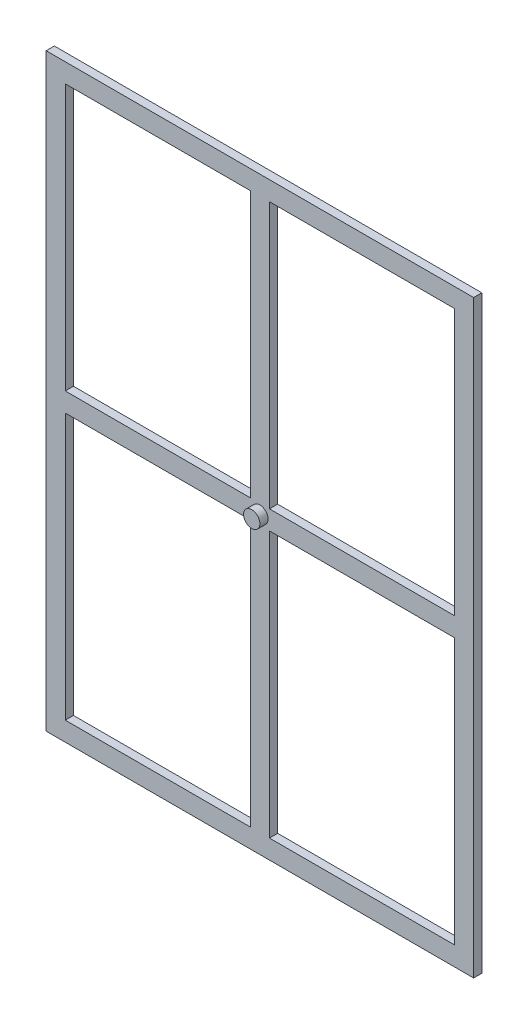
ISO-10303-21;
HEADER;
FILE_DESCRIPTION(('STEP AP214'),'2;1');
FILE_NAME('part.step','',(''),(''),'','','');
FILE_SCHEMA(('AUTOMOTIVE_DESIGN { 1 0 10303 214 1 1 1 1 }'));
ENDSEC;
DATA;
#1=APPLICATION_CONTEXT('core data for automotive mechanical design processes');
#2=APPLICATION_PROTOCOL_DEFINITION('international standard','automotive_design',2000,#1);
#3=PRODUCT_CONTEXT('',#1,'mechanical');
#4=PRODUCT('Part','Part','',(#3));
#5=PRODUCT_RELATED_PRODUCT_CATEGORY('part','',(#4));
#6=PRODUCT_DEFINITION_FORMATION('','',#4);
#7=PRODUCT_DEFINITION_CONTEXT('part definition',#1,'design');
#8=PRODUCT_DEFINITION('design','',#6,#7);
#9=PRODUCT_DEFINITION_SHAPE('','',#8);
#10=(LENGTH_UNIT() NAMED_UNIT(*) SI_UNIT(.MILLI.,.METRE.));
#11=(NAMED_UNIT(*) PLANE_ANGLE_UNIT() SI_UNIT($,.RADIAN.));
#12=(NAMED_UNIT(*) SI_UNIT($,.STERADIAN.) SOLID_ANGLE_UNIT());
#13=UNCERTAINTY_MEASURE_WITH_UNIT(LENGTH_MEASURE(1.E-05),#10,'distance_accuracy_value','');
#14=(GEOMETRIC_REPRESENTATION_CONTEXT(3) GLOBAL_UNCERTAINTY_ASSIGNED_CONTEXT((#13)) GLOBAL_UNIT_ASSIGNED_CONTEXT((#10,
#11,#12)) REPRESENTATION_CONTEXT('',''));
#15=CARTESIAN_POINT('',(0.,0.,0.));
#16=DIRECTION('',(0.,0.,1.));
#17=DIRECTION('',(1.,0.,0.));
#18=AXIS2_PLACEMENT_3D('',#15,#16,#17);
#19=CARTESIAN_POINT('',(0.,0.,3.));
#20=DIRECTION('',(0.,0.,1.));
#21=DIRECTION('',(1.,0.,0.));
#22=AXIS2_PLACEMENT_3D('',#19,#20,#21);
#23=PLANE('',#22);
#24=CARTESIAN_POINT('',(0.,0.,3.));
#25=DIRECTION('',(0.,0.,1.));
#26=DIRECTION('',(1.,0.,0.));
#27=AXIS2_PLACEMENT_3D('',#24,#25,#26);
#28=CIRCLE('',#27,3.);
#29=CARTESIAN_POINT('',(3.,0.,3.));
#30=VERTEX_POINT('',#29);
#31=EDGE_CURVE('E716',#30,#30,#28,.T.);
#32=ORIENTED_EDGE('',*,*,#31,.F.);
#33=EDGE_LOOP('',(#32));
#34=FACE_BOUND('',#33,.T.);
#35=DIRECTION('',(0.,-1.,0.));
#36=VECTOR('',#35,1.);
#37=CARTESIAN_POINT('',(-78.34,108.,3.));
#38=LINE('',#37,#36);
#39=CARTESIAN_POINT('',(-78.34,108.,3.));
#40=VERTEX_POINT('',#39);
#41=CARTESIAN_POINT('',(-78.34,-108.,3.));
#42=VERTEX_POINT('',#41);
#43=EDGE_CURVE('E361',#40,#42,#38,.T.);
#44=ORIENTED_EDGE('',*,*,#43,.T.);
#45=DIRECTION('',(1.,0.,0.));
#46=VECTOR('',#45,1.);
#47=CARTESIAN_POINT('',(-78.34,-108.,3.));
#48=LINE('',#47,#46);
#49=CARTESIAN_POINT('',(78.34,-108.,3.));
#50=VERTEX_POINT('',#49);
#51=EDGE_CURVE('E365',#42,#50,#48,.T.);
#52=ORIENTED_EDGE('',*,*,#51,.T.);
#53=DIRECTION('',(0.,1.,0.));
#54=VECTOR('',#53,1.);
#55=CARTESIAN_POINT('',(78.34,108.,3.));
#56=LINE('',#55,#54);
#57=CARTESIAN_POINT('',(78.34,108.,3.));
#58=VERTEX_POINT('',#57);
#59=EDGE_CURVE('E369',#50,#58,#56,.T.);
#60=ORIENTED_EDGE('',*,*,#59,.T.);
#61=DIRECTION('',(-1.,0.,0.));
#62=VECTOR('',#61,1.);
#63=CARTESIAN_POINT('',(-78.34,108.,3.));
#64=LINE('',#63,#62);
#65=EDGE_CURVE('E372',#58,#40,#64,.T.);
#66=ORIENTED_EDGE('',*,*,#65,.T.);
#67=EDGE_LOOP('',(#44,#52,#60,#66));
#68=FACE_BOUND('',#67,.T.);
#69=DIRECTION('',(1.,0.,0.));
#70=VECTOR('',#69,1.);
#71=CARTESIAN_POINT('',(-71.34,3.50000000000002,3.));
#72=LINE('',#71,#70);
#73=CARTESIAN_POINT('',(-71.34,3.50000000000002,3.));
#74=VERTEX_POINT('',#73);
#75=CARTESIAN_POINT('',(-3.50000000000003,3.50000000000002,3.));
#76=VERTEX_POINT('',#75);
#77=EDGE_CURVE('E321',#74,#76,#72,.T.);
#78=ORIENTED_EDGE('',*,*,#77,.F.);
#79=DIRECTION('',(0.,-1.,0.));
#80=VECTOR('',#79,1.);
#81=CARTESIAN_POINT('',(-71.34,101.,3.));
#82=LINE('',#81,#80);
#83=CARTESIAN_POINT('',(-71.34,101.,3.));
#84=VERTEX_POINT('',#83);
#85=EDGE_CURVE('E318',#84,#74,#82,.T.);
#86=ORIENTED_EDGE('',*,*,#85,.F.);
#87=DIRECTION('',(-1.,0.,0.));
#88=VECTOR('',#87,1.);
#89=CARTESIAN_POINT('',(-71.34,101.,3.));
#90=LINE('',#89,#88);
#91=CARTESIAN_POINT('',(-3.50000000000003,101.,3.));
#92=VERTEX_POINT('',#91);
#93=EDGE_CURVE('E329',#92,#84,#90,.T.);
#94=ORIENTED_EDGE('',*,*,#93,.F.);
#95=DIRECTION('',(0.,1.,0.));
#96=VECTOR('',#95,1.);
#97=CARTESIAN_POINT('',(-3.50000000000003,101.,3.));
#98=LINE('',#97,#96);
#99=EDGE_CURVE('E325',#76,#92,#98,.T.);
#100=ORIENTED_EDGE('',*,*,#99,.F.);
#101=EDGE_LOOP('',(#78,#86,#94,#100));
#102=FACE_BOUND('',#101,.T.);
#103=DIRECTION('',(1.,0.,0.));
#104=VECTOR('',#103,1.);
#105=CARTESIAN_POINT('',(3.49999999999998,3.50000000000002,3.));
#106=LINE('',#105,#104);
#107=CARTESIAN_POINT('',(3.49999999999998,3.50000000000002,3.));
#108=VERTEX_POINT('',#107);
#109=CARTESIAN_POINT('',(71.3399999999999,3.50000000000002,3.));
#110=VERTEX_POINT('',#109);
#111=EDGE_CURVE('E278',#108,#110,#106,.T.);
#112=ORIENTED_EDGE('',*,*,#111,.F.);
#113=DIRECTION('',(0.,-1.,0.));
#114=VECTOR('',#113,1.);
#115=CARTESIAN_POINT('',(3.49999999999998,101.,3.));
#116=LINE('',#115,#114);
#117=CARTESIAN_POINT('',(3.49999999999998,101.,3.));
#118=VERTEX_POINT('',#117);
#119=EDGE_CURVE('E275',#118,#108,#116,.T.);
#120=ORIENTED_EDGE('',*,*,#119,.F.);
#121=DIRECTION('',(-1.,0.,0.));
#122=VECTOR('',#121,1.);
#123=CARTESIAN_POINT('',(3.49999999999998,101.,3.));
#124=LINE('',#123,#122);
#125=CARTESIAN_POINT('',(71.3399999999999,101.,3.));
#126=VERTEX_POINT('',#125);
#127=EDGE_CURVE('E286',#126,#118,#124,.T.);
#128=ORIENTED_EDGE('',*,*,#127,.F.);
#129=DIRECTION('',(0.,1.,0.));
#130=VECTOR('',#129,1.);
#131=CARTESIAN_POINT('',(71.3399999999999,101.,3.));
#132=LINE('',#131,#130);
#133=EDGE_CURVE('E282',#110,#126,#132,.T.);
#134=ORIENTED_EDGE('',*,*,#133,.F.);
#135=EDGE_LOOP('',(#112,#120,#128,#134));
#136=FACE_BOUND('',#135,.T.);
#137=DIRECTION('',(1.,0.,0.));
#138=VECTOR('',#137,1.);
#139=CARTESIAN_POINT('',(-71.34,-101.,3.));
#140=LINE('',#139,#138);
#141=CARTESIAN_POINT('',(-71.34,-101.,3.));
#142=VERTEX_POINT('',#141);
#143=CARTESIAN_POINT('',(-3.50000000000003,-101.,3.));
#144=VERTEX_POINT('',#143);
#145=EDGE_CURVE('E235',#142,#144,#140,.T.);
#146=ORIENTED_EDGE('',*,*,#145,.F.);
#147=DIRECTION('',(0.,-1.,0.));
#148=VECTOR('',#147,1.);
#149=CARTESIAN_POINT('',(-71.34,-3.49999999999998,3.));
#150=LINE('',#149,#148);
#151=CARTESIAN_POINT('',(-71.34,-3.49999999999998,3.));
#152=VERTEX_POINT('',#151);
#153=EDGE_CURVE('E232',#152,#142,#150,.T.);
#154=ORIENTED_EDGE('',*,*,#153,.F.);
#155=DIRECTION('',(-1.,0.,0.));
#156=VECTOR('',#155,1.);
#157=CARTESIAN_POINT('',(-71.34,-3.49999999999998,3.));
#158=LINE('',#157,#156);
#159=CARTESIAN_POINT('',(-3.50000000000003,-3.49999999999998,3.));
#160=VERTEX_POINT('',#159);
#161=EDGE_CURVE('E243',#160,#152,#158,.T.);
#162=ORIENTED_EDGE('',*,*,#161,.F.);
#163=DIRECTION('',(0.,1.,0.));
#164=VECTOR('',#163,1.);
#165=CARTESIAN_POINT('',(-3.50000000000003,-3.49999999999998,3.));
#166=LINE('',#165,#164);
#167=EDGE_CURVE('E239',#144,#160,#166,.T.);
#168=ORIENTED_EDGE('',*,*,#167,.F.);
#169=EDGE_LOOP('',(#146,#154,#162,#168));
#170=FACE_BOUND('',#169,.T.);
#171=DIRECTION('',(1.,0.,0.));
#172=VECTOR('',#171,1.);
#173=CARTESIAN_POINT('',(3.49999999999998,-101.,3.));
#174=LINE('',#173,#172);
#175=CARTESIAN_POINT('',(3.49999999999998,-101.,3.));
#176=VERTEX_POINT('',#175);
#177=CARTESIAN_POINT('',(71.3399999999999,-101.,3.));
#178=VERTEX_POINT('',#177);
#179=EDGE_CURVE('E191',#176,#178,#174,.T.);
#180=ORIENTED_EDGE('',*,*,#179,.F.);
#181=DIRECTION('',(0.,-1.,0.));
#182=VECTOR('',#181,1.);
#183=CARTESIAN_POINT('',(3.49999999999998,-3.49999999999998,3.));
#184=LINE('',#183,#182);
#185=CARTESIAN_POINT('',(3.49999999999998,-3.49999999999998,3.));
#186=VERTEX_POINT('',#185);
#187=EDGE_CURVE('E182',#186,#176,#184,.T.);
#188=ORIENTED_EDGE('',*,*,#187,.F.);
#189=DIRECTION('',(-1.,0.,0.));
#190=VECTOR('',#189,1.);
#191=CARTESIAN_POINT('',(3.49999999999998,-3.49999999999998,3.));
#192=LINE('',#191,#190);
#193=CARTESIAN_POINT('',(71.3399999999999,-3.49999999999998,3.));
#194=VERTEX_POINT('',#193);
#195=EDGE_CURVE('E208',#194,#186,#192,.T.);
#196=ORIENTED_EDGE('',*,*,#195,.F.);
#197=DIRECTION('',(0.,1.,0.));
#198=VECTOR('',#197,1.);
#199=CARTESIAN_POINT('',(71.3399999999999,-3.49999999999998,3.));
#200=LINE('',#199,#198);
#201=EDGE_CURVE('E204',#178,#194,#200,.T.);
#202=ORIENTED_EDGE('',*,*,#201,.F.);
#203=EDGE_LOOP('',(#180,#188,#196,#202));
#204=FACE_BOUND('',#203,.T.);
#205=ADVANCED_FACE('F44',(#34,#68,#102,#136,#170,#204),#23,.T.);
#206=CARTESIAN_POINT('',(0.,0.,0.));
#207=DIRECTION('',(0.,0.,1.));
#208=DIRECTION('',(1.,0.,0.));
#209=AXIS2_PLACEMENT_3D('',#206,#207,#208);
#210=PLANE('',#209);
#211=CARTESIAN_POINT('',(74.34,-104.,0.));
#212=DIRECTION('',(0.,0.,-1.));
#213=DIRECTION('',(-1.,0.,0.));
#214=AXIS2_PLACEMENT_3D('',#211,#212,#213);
#215=CIRCLE('',#214,2.);
#216=CARTESIAN_POINT('',(72.34,-104.,0.));
#217=VERTEX_POINT('',#216);
#218=EDGE_CURVE('E704',#217,#217,#215,.T.);
#219=ORIENTED_EDGE('',*,*,#218,.F.);
#220=EDGE_LOOP('',(#219));
#221=FACE_BOUND('',#220,.T.);
#222=CARTESIAN_POINT('',(-74.34,-104.,0.));
#223=DIRECTION('',(0.,0.,-1.));
#224=DIRECTION('',(-1.,0.,0.));
#225=AXIS2_PLACEMENT_3D('',#222,#223,#224);
#226=CIRCLE('',#225,2.);
#227=CARTESIAN_POINT('',(-76.34,-104.,0.));
#228=VERTEX_POINT('',#227);
#229=EDGE_CURVE('E734',#228,#228,#226,.T.);
#230=ORIENTED_EDGE('',*,*,#229,.F.);
#231=EDGE_LOOP('',(#230));
#232=FACE_BOUND('',#231,.T.);
#233=CARTESIAN_POINT('',(-74.34,104.,0.));
#234=DIRECTION('',(0.,0.,-1.));
#235=DIRECTION('',(-1.,0.,0.));
#236=AXIS2_PLACEMENT_3D('',#233,#234,#235);
#237=CIRCLE('',#236,2.);
#238=CARTESIAN_POINT('',(-76.34,104.,0.));
#239=VERTEX_POINT('',#238);
#240=EDGE_CURVE('E721',#239,#239,#237,.T.);
#241=ORIENTED_EDGE('',*,*,#240,.F.);
#242=EDGE_LOOP('',(#241));
#243=FACE_BOUND('',#242,.T.);
#244=CARTESIAN_POINT('',(74.34,104.,0.));
#245=DIRECTION('',(0.,0.,-1.));
#246=DIRECTION('',(-1.,0.,0.));
#247=AXIS2_PLACEMENT_3D('',#244,#245,#246);
#248=CIRCLE('',#247,2.);
#249=CARTESIAN_POINT('',(72.34,104.,0.));
#250=VERTEX_POINT('',#249);
#251=EDGE_CURVE('E717',#250,#250,#248,.T.);
#252=ORIENTED_EDGE('',*,*,#251,.F.);
#253=EDGE_LOOP('',(#252));
#254=FACE_BOUND('',#253,.T.);
#255=DIRECTION('',(0.,-1.,0.));
#256=VECTOR('',#255,1.);
#257=CARTESIAN_POINT('',(-71.34,-3.49999999999998,0.));
#258=LINE('',#257,#256);
#259=CARTESIAN_POINT('',(-71.34,-3.49999999999998,0.));
#260=VERTEX_POINT('',#259);
#261=CARTESIAN_POINT('',(-71.34,-101.,0.));
#262=VERTEX_POINT('',#261);
#263=EDGE_CURVE('E200',#260,#262,#258,.T.);
#264=ORIENTED_EDGE('',*,*,#263,.T.);
#265=DIRECTION('',(1.,0.,0.));
#266=VECTOR('',#265,1.);
#267=CARTESIAN_POINT('',(-71.34,-101.,0.));
#268=LINE('',#267,#266);
#269=CARTESIAN_POINT('',(-3.50000000000003,-101.,0.));
#270=VERTEX_POINT('',#269);
#271=EDGE_CURVE('E250',#262,#270,#268,.T.);
#272=ORIENTED_EDGE('',*,*,#271,.T.);
#273=DIRECTION('',(0.,1.,0.));
#274=VECTOR('',#273,1.);
#275=CARTESIAN_POINT('',(-3.50000000000003,-3.49999999999998,0.));
#276=LINE('',#275,#274);
#277=CARTESIAN_POINT('',(-3.50000000000003,-3.49999999999998,0.));
#278=VERTEX_POINT('',#277);
#279=EDGE_CURVE('E254',#270,#278,#276,.T.);
#280=ORIENTED_EDGE('',*,*,#279,.T.);
#281=DIRECTION('',(-1.,0.,0.));
#282=VECTOR('',#281,1.);
#283=CARTESIAN_POINT('',(-71.34,-3.49999999999998,0.));
#284=LINE('',#283,#282);
#285=EDGE_CURVE('E236',#278,#260,#284,.T.);
#286=ORIENTED_EDGE('',*,*,#285,.T.);
#287=EDGE_LOOP('',(#264,#272,#280,#286));
#288=FACE_BOUND('',#287,.T.);
#289=DIRECTION('',(0.,-1.,0.));
#290=VECTOR('',#289,1.);
#291=CARTESIAN_POINT('',(-71.34,101.,0.));
#292=LINE('',#291,#290);
#293=CARTESIAN_POINT('',(-71.34,101.,0.));
#294=VERTEX_POINT('',#293);
#295=CARTESIAN_POINT('',(-71.34,3.50000000000002,0.));
#296=VERTEX_POINT('',#295);
#297=EDGE_CURVE('E317',#294,#296,#292,.T.);
#298=ORIENTED_EDGE('',*,*,#297,.T.);
#299=DIRECTION('',(1.,0.,0.));
#300=VECTOR('',#299,1.);
#301=CARTESIAN_POINT('',(-71.34,3.50000000000002,0.));
#302=LINE('',#301,#300);
#303=CARTESIAN_POINT('',(-3.50000000000003,3.50000000000002,0.));
#304=VERTEX_POINT('',#303);
#305=EDGE_CURVE('E336',#296,#304,#302,.T.);
#306=ORIENTED_EDGE('',*,*,#305,.T.);
#307=DIRECTION('',(0.,1.,0.));
#308=VECTOR('',#307,1.);
#309=CARTESIAN_POINT('',(-3.50000000000003,101.,0.));
#310=LINE('',#309,#308);
#311=CARTESIAN_POINT('',(-3.50000000000003,101.,0.));
#312=VERTEX_POINT('',#311);
#313=EDGE_CURVE('E340',#304,#312,#310,.T.);
#314=ORIENTED_EDGE('',*,*,#313,.T.);
#315=DIRECTION('',(-1.,0.,0.));
#316=VECTOR('',#315,1.);
#317=CARTESIAN_POINT('',(-71.34,101.,0.));
#318=LINE('',#317,#316);
#319=EDGE_CURVE('E322',#312,#294,#318,.T.);
#320=ORIENTED_EDGE('',*,*,#319,.T.);
#321=EDGE_LOOP('',(#298,#306,#314,#320));
#322=FACE_BOUND('',#321,.T.);
#323=DIRECTION('',(0.,-1.,0.));
#324=VECTOR('',#323,1.);
#325=CARTESIAN_POINT('',(-78.34,108.,0.));
#326=LINE('',#325,#324);
#327=CARTESIAN_POINT('',(-78.34,108.,0.));
#328=VERTEX_POINT('',#327);
#329=CARTESIAN_POINT('',(-78.34,-108.,0.));
#330=VERTEX_POINT('',#329);
#331=EDGE_CURVE('E360',#328,#330,#326,.T.);
#332=ORIENTED_EDGE('',*,*,#331,.F.);
#333=DIRECTION('',(-1.,0.,0.));
#334=VECTOR('',#333,1.);
#335=CARTESIAN_POINT('',(-78.34,108.,0.));
#336=LINE('',#335,#334);
#337=CARTESIAN_POINT('',(78.34,108.,0.));
#338=VERTEX_POINT('',#337);
#339=EDGE_CURVE('E366',#338,#328,#336,.T.);
#340=ORIENTED_EDGE('',*,*,#339,.F.);
#341=DIRECTION('',(0.,1.,0.));
#342=VECTOR('',#341,1.);
#343=CARTESIAN_POINT('',(78.34,108.,0.));
#344=LINE('',#343,#342);
#345=CARTESIAN_POINT('',(78.34,-108.,0.));
#346=VERTEX_POINT('',#345);
#347=EDGE_CURVE('E382',#346,#338,#344,.T.);
#348=ORIENTED_EDGE('',*,*,#347,.F.);
#349=DIRECTION('',(1.,0.,0.));
#350=VECTOR('',#349,1.);
#351=CARTESIAN_POINT('',(-78.34,-108.,0.));
#352=LINE('',#351,#350);
#353=EDGE_CURVE('E379',#330,#346,#352,.T.);
#354=ORIENTED_EDGE('',*,*,#353,.F.);
#355=EDGE_LOOP('',(#332,#340,#348,#354));
#356=FACE_BOUND('',#355,.T.);
#357=DIRECTION('',(0.,-1.,0.));
#358=VECTOR('',#357,1.);
#359=CARTESIAN_POINT('',(3.49999999999998,101.,0.));
#360=LINE('',#359,#358);
#361=CARTESIAN_POINT('',(3.49999999999998,101.,0.));
#362=VERTEX_POINT('',#361);
#363=CARTESIAN_POINT('',(3.49999999999998,3.50000000000002,0.));
#364=VERTEX_POINT('',#363);
#365=EDGE_CURVE('E274',#362,#364,#360,.T.);
#366=ORIENTED_EDGE('',*,*,#365,.T.);
#367=DIRECTION('',(1.,0.,0.));
#368=VECTOR('',#367,1.);
#369=CARTESIAN_POINT('',(3.49999999999998,3.50000000000002,0.));
#370=LINE('',#369,#368);
#371=CARTESIAN_POINT('',(71.3399999999999,3.50000000000002,0.));
#372=VERTEX_POINT('',#371);
#373=EDGE_CURVE('E293',#364,#372,#370,.T.);
#374=ORIENTED_EDGE('',*,*,#373,.T.);
#375=DIRECTION('',(0.,1.,0.));
#376=VECTOR('',#375,1.);
#377=CARTESIAN_POINT('',(71.3399999999999,101.,0.));
#378=LINE('',#377,#376);
#379=CARTESIAN_POINT('',(71.3399999999999,101.,0.));
#380=VERTEX_POINT('',#379);
#381=EDGE_CURVE('E297',#372,#380,#378,.T.);
#382=ORIENTED_EDGE('',*,*,#381,.T.);
#383=DIRECTION('',(-1.,0.,0.));
#384=VECTOR('',#383,1.);
#385=CARTESIAN_POINT('',(3.49999999999998,101.,0.));
#386=LINE('',#385,#384);
#387=EDGE_CURVE('E279',#380,#362,#386,.T.);
#388=ORIENTED_EDGE('',*,*,#387,.T.);
#389=EDGE_LOOP('',(#366,#374,#382,#388));
#390=FACE_BOUND('',#389,.T.);
#391=DIRECTION('',(0.,-1.,0.));
#392=VECTOR('',#391,1.);
#393=CARTESIAN_POINT('',(3.49999999999998,-3.49999999999998,0.));
#394=LINE('',#393,#392);
#395=CARTESIAN_POINT('',(3.49999999999998,-3.49999999999998,0.));
#396=VERTEX_POINT('',#395);
#397=CARTESIAN_POINT('',(3.49999999999998,-101.,0.));
#398=VERTEX_POINT('',#397);
#399=EDGE_CURVE('E68',#396,#398,#394,.T.);
#400=ORIENTED_EDGE('',*,*,#399,.T.);
#401=DIRECTION('',(1.,0.,0.));
#402=VECTOR('',#401,1.);
#403=CARTESIAN_POINT('',(3.49999999999998,-101.,0.));
#404=LINE('',#403,#402);
#405=CARTESIAN_POINT('',(71.3399999999999,-101.,0.));
#406=VERTEX_POINT('',#405);
#407=EDGE_CURVE('E198',#398,#406,#404,.T.);
#408=ORIENTED_EDGE('',*,*,#407,.T.);
#409=DIRECTION('',(0.,1.,0.));
#410=VECTOR('',#409,1.);
#411=CARTESIAN_POINT('',(71.3399999999999,-3.49999999999998,0.));
#412=LINE('',#411,#410);
#413=CARTESIAN_POINT('',(71.3399999999999,-3.49999999999998,0.));
#414=VERTEX_POINT('',#413);
#415=EDGE_CURVE('E219',#406,#414,#412,.T.);
#416=ORIENTED_EDGE('',*,*,#415,.T.);
#417=DIRECTION('',(-1.,0.,0.));
#418=VECTOR('',#417,1.);
#419=CARTESIAN_POINT('',(3.49999999999998,-3.49999999999998,0.));
#420=LINE('',#419,#418);
#421=EDGE_CURVE('E192',#414,#396,#420,.T.);
#422=ORIENTED_EDGE('',*,*,#421,.T.);
#423=EDGE_LOOP('',(#400,#408,#416,#422));
#424=FACE_BOUND('',#423,.T.);
#425=ADVANCED_FACE('F405',(#221,#232,#243,#254,#288,#322,#356,#390,#424),#210,.F.);
#426=CARTESIAN_POINT('',(-78.34,108.,3.));
#427=DIRECTION('',(1.,0.,0.));
#428=DIRECTION('',(0.,0.,-1.));
#429=AXIS2_PLACEMENT_3D('',#426,#427,#428);
#430=PLANE('',#429);
#431=ORIENTED_EDGE('',*,*,#331,.T.);
#432=DIRECTION('',(0.,0.,-1.));
#433=VECTOR('',#432,1.);
#434=CARTESIAN_POINT('',(-78.34,-108.,3.));
#435=LINE('',#434,#433);
#436=EDGE_CURVE('E11',#42,#330,#435,.T.);
#437=ORIENTED_EDGE('',*,*,#436,.F.);
#438=ORIENTED_EDGE('',*,*,#43,.F.);
#439=DIRECTION('',(0.,0.,-1.));
#440=VECTOR('',#439,1.);
#441=CARTESIAN_POINT('',(-78.34,108.,3.));
#442=LINE('',#441,#440);
#443=EDGE_CURVE('E375',#40,#328,#442,.T.);
#444=ORIENTED_EDGE('',*,*,#443,.T.);
#445=EDGE_LOOP('',(#431,#437,#438,#444));
#446=FACE_BOUND('',#445,.T.);
#447=ADVANCED_FACE('F46',(#446),#430,.F.);
#448=CARTESIAN_POINT('',(-78.34,-108.,3.));
#449=DIRECTION('',(0.,1.,0.));
#450=DIRECTION('',(0.,0.,1.));
#451=AXIS2_PLACEMENT_3D('',#448,#449,#450);
#452=PLANE('',#451);
#453=ORIENTED_EDGE('',*,*,#353,.T.);
#454=DIRECTION('',(0.,0.,-1.));
#455=VECTOR('',#454,1.);
#456=CARTESIAN_POINT('',(78.34,-108.,3.));
#457=LINE('',#456,#455);
#458=EDGE_CURVE('E53',#50,#346,#457,.T.);
#459=ORIENTED_EDGE('',*,*,#458,.F.);
#460=ORIENTED_EDGE('',*,*,#51,.F.);
#461=ORIENTED_EDGE('',*,*,#436,.T.);
#462=EDGE_LOOP('',(#453,#459,#460,#461));
#463=FACE_BOUND('',#462,.T.);
#464=ADVANCED_FACE('F416',(#463),#452,.F.);
#465=CARTESIAN_POINT('',(78.34,108.,3.));
#466=DIRECTION('',(-1.,0.,0.));
#467=DIRECTION('',(0.,0.,1.));
#468=AXIS2_PLACEMENT_3D('',#465,#466,#467);
#469=PLANE('',#468);
#470=ORIENTED_EDGE('',*,*,#347,.T.);
#471=DIRECTION('',(0.,0.,-1.));
#472=VECTOR('',#471,1.);
#473=CARTESIAN_POINT('',(78.34,108.,3.));
#474=LINE('',#473,#472);
#475=EDGE_CURVE('E390',#58,#338,#474,.T.);
#476=ORIENTED_EDGE('',*,*,#475,.F.);
#477=ORIENTED_EDGE('',*,*,#59,.F.);
#478=ORIENTED_EDGE('',*,*,#458,.T.);
#479=EDGE_LOOP('',(#470,#476,#477,#478));
#480=FACE_BOUND('',#479,.T.);
#481=ADVANCED_FACE('F399',(#480),#469,.F.);
#482=CARTESIAN_POINT('',(-78.34,108.,3.));
#483=DIRECTION('',(0.,-1.,0.));
#484=DIRECTION('',(0.,0.,-1.));
#485=AXIS2_PLACEMENT_3D('',#482,#483,#484);
#486=PLANE('',#485);
#487=ORIENTED_EDGE('',*,*,#339,.T.);
#488=ORIENTED_EDGE('',*,*,#443,.F.);
#489=ORIENTED_EDGE('',*,*,#65,.F.);
#490=ORIENTED_EDGE('',*,*,#475,.T.);
#491=EDGE_LOOP('',(#487,#488,#489,#490));
#492=FACE_BOUND('',#491,.T.);
#493=ADVANCED_FACE('F409',(#492),#486,.F.);
#494=CARTESIAN_POINT('',(-71.34,101.,3.));
#495=DIRECTION('',(1.,0.,0.));
#496=DIRECTION('',(0.,0.,-1.));
#497=AXIS2_PLACEMENT_3D('',#494,#495,#496);
#498=PLANE('',#497);
#499=ORIENTED_EDGE('',*,*,#297,.F.);
#500=DIRECTION('',(0.,0.,-1.));
#501=VECTOR('',#500,1.);
#502=CARTESIAN_POINT('',(-71.34,101.,3.));
#503=LINE('',#502,#501);
#504=EDGE_CURVE('E332',#84,#294,#503,.T.);
#505=ORIENTED_EDGE('',*,*,#504,.F.);
#506=ORIENTED_EDGE('',*,*,#85,.T.);
#507=DIRECTION('',(0.,0.,-1.));
#508=VECTOR('',#507,1.);
#509=CARTESIAN_POINT('',(-71.34,3.50000000000002,3.));
#510=LINE('',#509,#508);
#511=EDGE_CURVE('E356',#74,#296,#510,.T.);
#512=ORIENTED_EDGE('',*,*,#511,.T.);
#513=EDGE_LOOP('',(#499,#505,#506,#512));
#514=FACE_BOUND('',#513,.T.);
#515=ADVANCED_FACE('F435',(#514),#498,.T.);
#516=CARTESIAN_POINT('',(-71.34,3.50000000000002,3.));
#517=DIRECTION('',(0.,1.,0.));
#518=DIRECTION('',(0.,0.,1.));
#519=AXIS2_PLACEMENT_3D('',#516,#517,#518);
#520=PLANE('',#519);
#521=ORIENTED_EDGE('',*,*,#305,.F.);
#522=ORIENTED_EDGE('',*,*,#511,.F.);
#523=ORIENTED_EDGE('',*,*,#77,.T.);
#524=DIRECTION('',(0.,0.,-1.));
#525=VECTOR('',#524,1.);
#526=CARTESIAN_POINT('',(-3.50000000000003,3.50000000000002,3.));
#527=LINE('',#526,#525);
#528=EDGE_CURVE('E353',#76,#304,#527,.T.);
#529=ORIENTED_EDGE('',*,*,#528,.T.);
#530=EDGE_LOOP('',(#521,#522,#523,#529));
#531=FACE_BOUND('',#530,.T.);
#532=ADVANCED_FACE('F442',(#531),#520,.T.);
#533=CARTESIAN_POINT('',(-3.50000000000003,101.,3.));
#534=DIRECTION('',(-1.,0.,0.));
#535=DIRECTION('',(0.,0.,1.));
#536=AXIS2_PLACEMENT_3D('',#533,#534,#535);
#537=PLANE('',#536);
#538=ORIENTED_EDGE('',*,*,#313,.F.);
#539=ORIENTED_EDGE('',*,*,#528,.F.);
#540=ORIENTED_EDGE('',*,*,#99,.T.);
#541=DIRECTION('',(0.,0.,-1.));
#542=VECTOR('',#541,1.);
#543=CARTESIAN_POINT('',(-3.50000000000003,101.,3.));
#544=LINE('',#543,#542);
#545=EDGE_CURVE('E350',#92,#312,#544,.T.);
#546=ORIENTED_EDGE('',*,*,#545,.T.);
#547=EDGE_LOOP('',(#538,#539,#540,#546));
#548=FACE_BOUND('',#547,.T.);
#549=ADVANCED_FACE('F447',(#548),#537,.T.);
#550=CARTESIAN_POINT('',(-71.34,101.,3.));
#551=DIRECTION('',(0.,-1.,0.));
#552=DIRECTION('',(0.,0.,-1.));
#553=AXIS2_PLACEMENT_3D('',#550,#551,#552);
#554=PLANE('',#553);
#555=ORIENTED_EDGE('',*,*,#319,.F.);
#556=ORIENTED_EDGE('',*,*,#545,.F.);
#557=ORIENTED_EDGE('',*,*,#93,.T.);
#558=ORIENTED_EDGE('',*,*,#504,.T.);
#559=EDGE_LOOP('',(#555,#556,#557,#558));
#560=FACE_BOUND('',#559,.T.);
#561=ADVANCED_FACE('F455',(#560),#554,.T.);
#562=CARTESIAN_POINT('',(3.49999999999998,101.,3.));
#563=DIRECTION('',(1.,0.,0.));
#564=DIRECTION('',(0.,0.,-1.));
#565=AXIS2_PLACEMENT_3D('',#562,#563,#564);
#566=PLANE('',#565);
#567=ORIENTED_EDGE('',*,*,#365,.F.);
#568=DIRECTION('',(0.,0.,-1.));
#569=VECTOR('',#568,1.);
#570=CARTESIAN_POINT('',(3.49999999999998,101.,3.));
#571=LINE('',#570,#569);
#572=EDGE_CURVE('E289',#118,#362,#571,.T.);
#573=ORIENTED_EDGE('',*,*,#572,.F.);
#574=ORIENTED_EDGE('',*,*,#119,.T.);
#575=DIRECTION('',(0.,0.,-1.));
#576=VECTOR('',#575,1.);
#577=CARTESIAN_POINT('',(3.49999999999998,3.50000000000002,3.));
#578=LINE('',#577,#576);
#579=EDGE_CURVE('E313',#108,#364,#578,.T.);
#580=ORIENTED_EDGE('',*,*,#579,.T.);
#581=EDGE_LOOP('',(#567,#573,#574,#580));
#582=FACE_BOUND('',#581,.T.);
#583=ADVANCED_FACE('F510',(#582),#566,.T.);
#584=CARTESIAN_POINT('',(3.49999999999998,3.50000000000002,3.));
#585=DIRECTION('',(0.,1.,0.));
#586=DIRECTION('',(0.,0.,1.));
#587=AXIS2_PLACEMENT_3D('',#584,#585,#586);
#588=PLANE('',#587);
#589=ORIENTED_EDGE('',*,*,#373,.F.);
#590=ORIENTED_EDGE('',*,*,#579,.F.);
#591=ORIENTED_EDGE('',*,*,#111,.T.);
#592=DIRECTION('',(0.,0.,-1.));
#593=VECTOR('',#592,1.);
#594=CARTESIAN_POINT('',(71.3399999999999,3.50000000000002,3.));
#595=LINE('',#594,#593);
#596=EDGE_CURVE('E310',#110,#372,#595,.T.);
#597=ORIENTED_EDGE('',*,*,#596,.T.);
#598=EDGE_LOOP('',(#589,#590,#591,#597));
#599=FACE_BOUND('',#598,.T.);
#600=ADVANCED_FACE('F506',(#599),#588,.T.);
#601=CARTESIAN_POINT('',(71.3399999999999,101.,3.));
#602=DIRECTION('',(-1.,0.,0.));
#603=DIRECTION('',(0.,0.,1.));
#604=AXIS2_PLACEMENT_3D('',#601,#602,#603);
#605=PLANE('',#604);
#606=ORIENTED_EDGE('',*,*,#381,.F.);
#607=ORIENTED_EDGE('',*,*,#596,.F.);
#608=ORIENTED_EDGE('',*,*,#133,.T.);
#609=DIRECTION('',(0.,0.,-1.));
#610=VECTOR('',#609,1.);
#611=CARTESIAN_POINT('',(71.3399999999999,101.,3.));
#612=LINE('',#611,#610);
#613=EDGE_CURVE('E307',#126,#380,#612,.T.);
#614=ORIENTED_EDGE('',*,*,#613,.T.);
#615=EDGE_LOOP('',(#606,#607,#608,#614));
#616=FACE_BOUND('',#615,.T.);
#617=ADVANCED_FACE('F502',(#616),#605,.T.);
#618=CARTESIAN_POINT('',(3.49999999999998,101.,3.));
#619=DIRECTION('',(0.,-1.,0.));
#620=DIRECTION('',(0.,0.,-1.));
#621=AXIS2_PLACEMENT_3D('',#618,#619,#620);
#622=PLANE('',#621);
#623=ORIENTED_EDGE('',*,*,#387,.F.);
#624=ORIENTED_EDGE('',*,*,#613,.F.);
#625=ORIENTED_EDGE('',*,*,#127,.T.);
#626=ORIENTED_EDGE('',*,*,#572,.T.);
#627=EDGE_LOOP('',(#623,#624,#625,#626));
#628=FACE_BOUND('',#627,.T.);
#629=ADVANCED_FACE('F499',(#628),#622,.T.);
#630=CARTESIAN_POINT('',(-71.34,-3.49999999999998,3.));
#631=DIRECTION('',(1.,0.,0.));
#632=DIRECTION('',(0.,0.,-1.));
#633=AXIS2_PLACEMENT_3D('',#630,#631,#632);
#634=PLANE('',#633);
#635=ORIENTED_EDGE('',*,*,#263,.F.);
#636=DIRECTION('',(0.,0.,-1.));
#637=VECTOR('',#636,1.);
#638=CARTESIAN_POINT('',(-71.34,-3.49999999999998,3.));
#639=LINE('',#638,#637);
#640=EDGE_CURVE('E246',#152,#260,#639,.T.);
#641=ORIENTED_EDGE('',*,*,#640,.F.);
#642=ORIENTED_EDGE('',*,*,#153,.T.);
#643=DIRECTION('',(0.,0.,-1.));
#644=VECTOR('',#643,1.);
#645=CARTESIAN_POINT('',(-71.34,-101.,3.));
#646=LINE('',#645,#644);
#647=EDGE_CURVE('E270',#142,#262,#646,.T.);
#648=ORIENTED_EDGE('',*,*,#647,.T.);
#649=EDGE_LOOP('',(#635,#641,#642,#648));
#650=FACE_BOUND('',#649,.T.);
#651=ADVANCED_FACE('F481',(#650),#634,.T.);
#652=CARTESIAN_POINT('',(-71.34,-101.,3.));
#653=DIRECTION('',(0.,1.,0.));
#654=DIRECTION('',(0.,0.,1.));
#655=AXIS2_PLACEMENT_3D('',#652,#653,#654);
#656=PLANE('',#655);
#657=ORIENTED_EDGE('',*,*,#271,.F.);
#658=ORIENTED_EDGE('',*,*,#647,.F.);
#659=ORIENTED_EDGE('',*,*,#145,.T.);
#660=DIRECTION('',(0.,0.,-1.));
#661=VECTOR('',#660,1.);
#662=CARTESIAN_POINT('',(-3.50000000000003,-101.,3.));
#663=LINE('',#662,#661);
#664=EDGE_CURVE('E267',#144,#270,#663,.T.);
#665=ORIENTED_EDGE('',*,*,#664,.T.);
#666=EDGE_LOOP('',(#657,#658,#659,#665));
#667=FACE_BOUND('',#666,.T.);
#668=ADVANCED_FACE('F474',(#667),#656,.T.);
#669=CARTESIAN_POINT('',(-3.50000000000003,-3.49999999999998,3.));
#670=DIRECTION('',(-1.,0.,0.));
#671=DIRECTION('',(0.,0.,1.));
#672=AXIS2_PLACEMENT_3D('',#669,#670,#671);
#673=PLANE('',#672);
#674=ORIENTED_EDGE('',*,*,#279,.F.);
#675=ORIENTED_EDGE('',*,*,#664,.F.);
#676=ORIENTED_EDGE('',*,*,#167,.T.);
#677=DIRECTION('',(0.,0.,-1.));
#678=VECTOR('',#677,1.);
#679=CARTESIAN_POINT('',(-3.50000000000003,-3.49999999999998,3.));
#680=LINE('',#679,#678);
#681=EDGE_CURVE('E264',#160,#278,#680,.T.);
#682=ORIENTED_EDGE('',*,*,#681,.T.);
#683=EDGE_LOOP('',(#674,#675,#676,#682));
#684=FACE_BOUND('',#683,.T.);
#685=ADVANCED_FACE('F477',(#684),#673,.T.);
#686=CARTESIAN_POINT('',(-71.34,-3.49999999999998,3.));
#687=DIRECTION('',(0.,-1.,0.));
#688=DIRECTION('',(0.,0.,-1.));
#689=AXIS2_PLACEMENT_3D('',#686,#687,#688);
#690=PLANE('',#689);
#691=ORIENTED_EDGE('',*,*,#285,.F.);
#692=ORIENTED_EDGE('',*,*,#681,.F.);
#693=ORIENTED_EDGE('',*,*,#161,.T.);
#694=ORIENTED_EDGE('',*,*,#640,.T.);
#695=EDGE_LOOP('',(#691,#692,#693,#694));
#696=FACE_BOUND('',#695,.T.);
#697=ADVANCED_FACE('F484',(#696),#690,.T.);
#698=CARTESIAN_POINT('',(3.49999999999998,-3.49999999999998,3.));
#699=DIRECTION('',(1.,0.,0.));
#700=DIRECTION('',(0.,0.,-1.));
#701=AXIS2_PLACEMENT_3D('',#698,#699,#700);
#702=PLANE('',#701);
#703=ORIENTED_EDGE('',*,*,#399,.F.);
#704=DIRECTION('',(0.,0.,-1.));
#705=VECTOR('',#704,1.);
#706=CARTESIAN_POINT('',(3.49999999999998,-3.49999999999998,3.));
#707=LINE('',#706,#705);
#708=EDGE_CURVE('E186',#186,#396,#707,.T.);
#709=ORIENTED_EDGE('',*,*,#708,.F.);
#710=ORIENTED_EDGE('',*,*,#187,.T.);
#711=DIRECTION('',(0.,0.,-1.));
#712=VECTOR('',#711,1.);
#713=CARTESIAN_POINT('',(3.49999999999998,-101.,3.));
#714=LINE('',#713,#712);
#715=EDGE_CURVE('E185',#176,#398,#714,.T.);
#716=ORIENTED_EDGE('',*,*,#715,.T.);
#717=EDGE_LOOP('',(#703,#709,#710,#716));
#718=FACE_BOUND('',#717,.T.);
#719=ADVANCED_FACE('F184',(#718),#702,.T.);
#720=CARTESIAN_POINT('',(3.49999999999998,-101.,3.));
#721=DIRECTION('',(0.,1.,0.));
#722=DIRECTION('',(0.,0.,1.));
#723=AXIS2_PLACEMENT_3D('',#720,#721,#722);
#724=PLANE('',#723);
#725=ORIENTED_EDGE('',*,*,#407,.F.);
#726=ORIENTED_EDGE('',*,*,#715,.F.);
#727=ORIENTED_EDGE('',*,*,#179,.T.);
#728=DIRECTION('',(0.,0.,-1.));
#729=VECTOR('',#728,1.);
#730=CARTESIAN_POINT('',(71.3399999999999,-101.,3.));
#731=LINE('',#730,#729);
#732=EDGE_CURVE('E201',#178,#406,#731,.T.);
#733=ORIENTED_EDGE('',*,*,#732,.T.);
#734=EDGE_LOOP('',(#725,#726,#727,#733));
#735=FACE_BOUND('',#734,.T.);
#736=ADVANCED_FACE('F195',(#735),#724,.T.);
#737=CARTESIAN_POINT('',(71.3399999999999,-3.49999999999998,3.));
#738=DIRECTION('',(-1.,0.,0.));
#739=DIRECTION('',(0.,0.,1.));
#740=AXIS2_PLACEMENT_3D('',#737,#738,#739);
#741=PLANE('',#740);
#742=ORIENTED_EDGE('',*,*,#415,.F.);
#743=ORIENTED_EDGE('',*,*,#732,.F.);
#744=ORIENTED_EDGE('',*,*,#201,.T.);
#745=DIRECTION('',(0.,0.,-1.));
#746=VECTOR('',#745,1.);
#747=CARTESIAN_POINT('',(71.3399999999999,-3.49999999999998,3.));
#748=LINE('',#747,#746);
#749=EDGE_CURVE('E60',#194,#414,#748,.T.);
#750=ORIENTED_EDGE('',*,*,#749,.T.);
#751=EDGE_LOOP('',(#742,#743,#744,#750));
#752=FACE_BOUND('',#751,.T.);
#753=ADVANCED_FACE('F582',(#752),#741,.T.);
#754=CARTESIAN_POINT('',(3.49999999999998,-3.49999999999998,3.));
#755=DIRECTION('',(0.,-1.,0.));
#756=DIRECTION('',(0.,0.,-1.));
#757=AXIS2_PLACEMENT_3D('',#754,#755,#756);
#758=PLANE('',#757);
#759=ORIENTED_EDGE('',*,*,#421,.F.);
#760=ORIENTED_EDGE('',*,*,#749,.F.);
#761=ORIENTED_EDGE('',*,*,#195,.T.);
#762=ORIENTED_EDGE('',*,*,#708,.T.);
#763=EDGE_LOOP('',(#759,#760,#761,#762));
#764=FACE_BOUND('',#763,.T.);
#765=ADVANCED_FACE('F590',(#764),#758,.T.);
#766=CARTESIAN_POINT('',(0.,0.,6.));
#767=DIRECTION('',(0.,0.,-1.));
#768=DIRECTION('',(-1.,0.,0.));
#769=AXIS2_PLACEMENT_3D('',#766,#767,#768);
#770=CYLINDRICAL_SURFACE('',#769,3.);
#771=CARTESIAN_POINT('',(0.,0.,6.));
#772=DIRECTION('',(0.,0.,1.));
#773=DIRECTION('',(1.,0.,0.));
#774=AXIS2_PLACEMENT_3D('',#771,#772,#773);
#775=CIRCLE('',#774,3.);
#776=CARTESIAN_POINT('',(3.,0.,6.));
#777=VERTEX_POINT('',#776);
#778=EDGE_CURVE('E216',#777,#777,#775,.T.);
#779=ORIENTED_EDGE('',*,*,#778,.F.);
#780=EDGE_LOOP('',(#779));
#781=FACE_BOUND('',#780,.T.);
#782=ORIENTED_EDGE('',*,*,#31,.T.);
#783=EDGE_LOOP('',(#782));
#784=FACE_BOUND('',#783,.T.);
#785=ADVANCED_FACE('F599',(#781,#784),#770,.T.);
#786=CARTESIAN_POINT('',(0.,0.,6.));
#787=DIRECTION('',(0.,0.,1.));
#788=DIRECTION('',(1.,0.,0.));
#789=AXIS2_PLACEMENT_3D('',#786,#787,#788);
#790=PLANE('',#789);
#791=ORIENTED_EDGE('',*,*,#778,.T.);
#792=EDGE_LOOP('',(#791));
#793=FACE_BOUND('',#792,.T.);
#794=ADVANCED_FACE('F607',(#793),#790,.T.);
#795=CARTESIAN_POINT('',(74.34,104.,1.));
#796=DIRECTION('',(0.,0.,-1.));
#797=DIRECTION('',(-1.,0.,0.));
#798=AXIS2_PLACEMENT_3D('',#795,#796,#797);
#799=CYLINDRICAL_SURFACE('',#798,2.);
#800=CARTESIAN_POINT('',(74.34,104.,1.));
#801=DIRECTION('',(0.,0.,-1.));
#802=DIRECTION('',(-1.,0.,0.));
#803=AXIS2_PLACEMENT_3D('',#800,#801,#802);
#804=CIRCLE('',#803,2.);
#805=CARTESIAN_POINT('',(72.34,104.,1.));
#806=VERTEX_POINT('',#805);
#807=EDGE_CURVE('E712',#806,#806,#804,.T.);
#808=ORIENTED_EDGE('',*,*,#807,.F.);
#809=EDGE_LOOP('',(#808));
#810=FACE_BOUND('',#809,.T.);
#811=ORIENTED_EDGE('',*,*,#251,.T.);
#812=EDGE_LOOP('',(#811));
#813=FACE_BOUND('',#812,.T.);
#814=ADVANCED_FACE('F617',(#810,#813),#799,.F.);
#815=CARTESIAN_POINT('',(74.34,104.,1.));
#816=DIRECTION('',(0.,0.,-1.));
#817=DIRECTION('',(-1.,0.,0.));
#818=AXIS2_PLACEMENT_3D('',#815,#816,#817);
#819=PLANE('',#818);
#820=ORIENTED_EDGE('',*,*,#807,.T.);
#821=EDGE_LOOP('',(#820));
#822=FACE_BOUND('',#821,.T.);
#823=ADVANCED_FACE('F627',(#822),#819,.T.);
#824=CARTESIAN_POINT('',(-74.34,104.,1.));
#825=DIRECTION('',(0.,0.,-1.));
#826=DIRECTION('',(-1.,0.,0.));
#827=AXIS2_PLACEMENT_3D('',#824,#825,#826);
#828=CYLINDRICAL_SURFACE('',#827,2.);
#829=CARTESIAN_POINT('',(-74.34,104.,1.));
#830=DIRECTION('',(0.,0.,-1.));
#831=DIRECTION('',(-1.,0.,0.));
#832=AXIS2_PLACEMENT_3D('',#829,#830,#831);
#833=CIRCLE('',#832,2.);
#834=CARTESIAN_POINT('',(-76.34,104.,1.));
#835=VERTEX_POINT('',#834);
#836=EDGE_CURVE('E730',#835,#835,#833,.T.);
#837=ORIENTED_EDGE('',*,*,#836,.F.);
#838=EDGE_LOOP('',(#837));
#839=FACE_BOUND('',#838,.T.);
#840=ORIENTED_EDGE('',*,*,#240,.T.);
#841=EDGE_LOOP('',(#840));
#842=FACE_BOUND('',#841,.T.);
#843=ADVANCED_FACE('F637',(#839,#842),#828,.F.);
#844=CARTESIAN_POINT('',(-74.34,104.,1.));
#845=DIRECTION('',(0.,0.,-1.));
#846=DIRECTION('',(-1.,0.,0.));
#847=AXIS2_PLACEMENT_3D('',#844,#845,#846);
#848=PLANE('',#847);
#849=ORIENTED_EDGE('',*,*,#836,.T.);
#850=EDGE_LOOP('',(#849));
#851=FACE_BOUND('',#850,.T.);
#852=ADVANCED_FACE('F647',(#851),#848,.T.);
#853=CARTESIAN_POINT('',(-74.34,-104.,1.));
#854=DIRECTION('',(0.,0.,-1.));
#855=DIRECTION('',(-1.,0.,0.));
#856=AXIS2_PLACEMENT_3D('',#853,#854,#855);
#857=CYLINDRICAL_SURFACE('',#856,2.);
#858=CARTESIAN_POINT('',(-74.34,-104.,1.));
#859=DIRECTION('',(0.,0.,-1.));
#860=DIRECTION('',(-1.,0.,0.));
#861=AXIS2_PLACEMENT_3D('',#858,#859,#860);
#862=CIRCLE('',#861,2.);
#863=CARTESIAN_POINT('',(-76.34,-104.,1.));
#864=VERTEX_POINT('',#863);
#865=EDGE_CURVE('E708',#864,#864,#862,.T.);
#866=ORIENTED_EDGE('',*,*,#865,.F.);
#867=EDGE_LOOP('',(#866));
#868=FACE_BOUND('',#867,.T.);
#869=ORIENTED_EDGE('',*,*,#229,.T.);
#870=EDGE_LOOP('',(#869));
#871=FACE_BOUND('',#870,.T.);
#872=ADVANCED_FACE('F657',(#868,#871),#857,.F.);
#873=CARTESIAN_POINT('',(-74.34,-104.,1.));
#874=DIRECTION('',(0.,0.,-1.));
#875=DIRECTION('',(-1.,0.,0.));
#876=AXIS2_PLACEMENT_3D('',#873,#874,#875);
#877=PLANE('',#876);
#878=ORIENTED_EDGE('',*,*,#865,.T.);
#879=EDGE_LOOP('',(#878));
#880=FACE_BOUND('',#879,.T.);
#881=ADVANCED_FACE('F667',(#880),#877,.T.);
#882=CARTESIAN_POINT('',(74.34,-104.,1.));
#883=DIRECTION('',(0.,0.,-1.));
#884=DIRECTION('',(-1.,0.,0.));
#885=AXIS2_PLACEMENT_3D('',#882,#883,#884);
#886=CYLINDRICAL_SURFACE('',#885,2.);
#887=CARTESIAN_POINT('',(74.34,-104.,1.));
#888=DIRECTION('',(0.,0.,-1.));
#889=DIRECTION('',(-1.,0.,0.));
#890=AXIS2_PLACEMENT_3D('',#887,#888,#889);
#891=CIRCLE('',#890,2.);
#892=CARTESIAN_POINT('',(72.34,-104.,1.));
#893=VERTEX_POINT('',#892);
#894=EDGE_CURVE('E702',#893,#893,#891,.T.);
#895=ORIENTED_EDGE('',*,*,#894,.F.);
#896=EDGE_LOOP('',(#895));
#897=FACE_BOUND('',#896,.T.);
#898=ORIENTED_EDGE('',*,*,#218,.T.);
#899=EDGE_LOOP('',(#898));
#900=FACE_BOUND('',#899,.T.);
#901=ADVANCED_FACE('F677',(#897,#900),#886,.F.);
#902=CARTESIAN_POINT('',(74.34,-104.,1.));
#903=DIRECTION('',(0.,0.,-1.));
#904=DIRECTION('',(-1.,0.,0.));
#905=AXIS2_PLACEMENT_3D('',#902,#903,#904);
#906=PLANE('',#905);
#907=ORIENTED_EDGE('',*,*,#894,.T.);
#908=EDGE_LOOP('',(#907));
#909=FACE_BOUND('',#908,.T.);
#910=ADVANCED_FACE('F687',(#909),#906,.T.);
#911=CLOSED_SHELL('',(#205,#425,#447,#464,#481,#493,#515,#532,#549,#561,#583,#600,#617,#629,
#651,#668,#685,#697,#719,#736,#753,#765,#785,#794,#814,#823,#843,#852,#872,#881,#901,#910));
#912=MANIFOLD_SOLID_BREP('B2',#911);
#913=ADVANCED_BREP_SHAPE_REPRESENTATION('',(#18,#912),#14);
#914=SHAPE_DEFINITION_REPRESENTATION(#9,#913);
ENDSEC;
END-ISO-10303-21;
